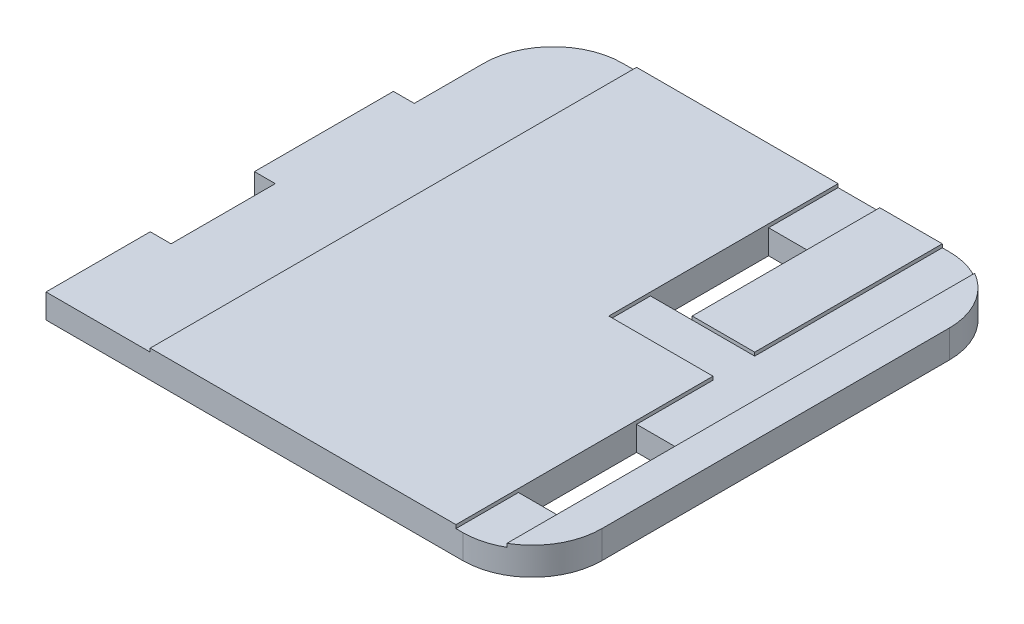
ISO-10303-21;
HEADER;
FILE_DESCRIPTION(('STEP AP214'),'2;1');
FILE_NAME('part.step','',(''),(''),'','','');
FILE_SCHEMA(('AUTOMOTIVE_DESIGN { 1 0 10303 214 1 1 1 1 }'));
ENDSEC;
DATA;
#1=APPLICATION_CONTEXT('core data for automotive mechanical design processes');
#2=APPLICATION_PROTOCOL_DEFINITION('international standard','automotive_design',2000,#1);
#3=PRODUCT_CONTEXT('',#1,'mechanical');
#4=PRODUCT('Part','Part','',(#3));
#5=PRODUCT_RELATED_PRODUCT_CATEGORY('part','',(#4));
#6=PRODUCT_DEFINITION_FORMATION('','',#4);
#7=PRODUCT_DEFINITION_CONTEXT('part definition',#1,'design');
#8=PRODUCT_DEFINITION('design','',#6,#7);
#9=PRODUCT_DEFINITION_SHAPE('','',#8);
#10=(LENGTH_UNIT() NAMED_UNIT(*) SI_UNIT(.MILLI.,.METRE.));
#11=(NAMED_UNIT(*) PLANE_ANGLE_UNIT() SI_UNIT($,.RADIAN.));
#12=(NAMED_UNIT(*) SI_UNIT($,.STERADIAN.) SOLID_ANGLE_UNIT());
#13=UNCERTAINTY_MEASURE_WITH_UNIT(LENGTH_MEASURE(1.E-05),#10,'distance_accuracy_value','');
#14=(GEOMETRIC_REPRESENTATION_CONTEXT(3) GLOBAL_UNCERTAINTY_ASSIGNED_CONTEXT((#13)) GLOBAL_UNIT_ASSIGNED_CONTEXT((#10,
#11,#12)) REPRESENTATION_CONTEXT('',''));
#15=CARTESIAN_POINT('',(0.,0.,0.));
#16=DIRECTION('',(0.,0.,1.));
#17=DIRECTION('',(1.,0.,0.));
#18=AXIS2_PLACEMENT_3D('',#15,#16,#17);
#19=CARTESIAN_POINT('',(0.,0.4,0.));
#20=DIRECTION('',(0.,1.,0.));
#21=DIRECTION('',(0.,0.,1.));
#22=AXIS2_PLACEMENT_3D('',#19,#20,#21);
#23=PLANE('',#22);
#24=DIRECTION('',(0.,0.,-1.));
#25=VECTOR('',#24,1.);
#26=CARTESIAN_POINT('',(1.5,0.4,0.));
#27=LINE('',#26,#25);
#28=CARTESIAN_POINT('',(1.5,0.4,0.));
#29=VERTEX_POINT('',#28);
#30=CARTESIAN_POINT('',(1.5,0.4,-7.));
#31=VERTEX_POINT('',#30);
#32=EDGE_CURVE('E317',#29,#31,#27,.T.);
#33=ORIENTED_EDGE('',*,*,#32,.F.);
#34=DIRECTION('',(1.,0.,0.));
#35=VECTOR('',#34,1.);
#36=CARTESIAN_POINT('',(0.,0.4,0.));
#37=LINE('',#36,#35);
#38=CARTESIAN_POINT('',(5.9,0.4,0.));
#39=VERTEX_POINT('',#38);
#40=EDGE_CURVE('E323',#29,#39,#37,.T.);
#41=ORIENTED_EDGE('',*,*,#40,.T.);
#42=DIRECTION('',(0.,0.,1.));
#43=VECTOR('',#42,1.);
#44=CARTESIAN_POINT('',(5.9,0.4,-0.9));
#45=LINE('',#44,#43);
#46=CARTESIAN_POINT('',(5.9,0.4,-3.7));
#47=VERTEX_POINT('',#46);
#48=EDGE_CURVE('E395',#47,#39,#45,.T.);
#49=ORIENTED_EDGE('',*,*,#48,.F.);
#50=DIRECTION('',(1.,0.,0.));
#51=VECTOR('',#50,1.);
#52=CARTESIAN_POINT('',(4.4,0.4,-3.7));
#53=LINE('',#52,#51);
#54=CARTESIAN_POINT('',(4.4,0.4,-3.7));
#55=VERTEX_POINT('',#54);
#56=EDGE_CURVE('E350',#55,#47,#53,.T.);
#57=ORIENTED_EDGE('',*,*,#56,.F.);
#58=DIRECTION('',(0.,0.,1.));
#59=VECTOR('',#58,1.);
#60=CARTESIAN_POINT('',(4.4,0.4,-6.));
#61=LINE('',#60,#59);
#62=CARTESIAN_POINT('',(4.4,0.4,-7.));
#63=VERTEX_POINT('',#62);
#64=EDGE_CURVE('E419',#63,#55,#61,.T.);
#65=ORIENTED_EDGE('',*,*,#64,.F.);
#66=DIRECTION('',(-1.,0.,0.));
#67=VECTOR('',#66,1.);
#68=CARTESIAN_POINT('',(7.,0.4,-7.));
#69=LINE('',#68,#67);
#70=EDGE_CURVE('E449',#63,#31,#69,.T.);
#71=ORIENTED_EDGE('',*,*,#70,.T.);
#72=EDGE_LOOP('',(#33,#41,#49,#57,#65,#71));
#73=FACE_BOUND('',#72,.T.);
#74=ADVANCED_FACE('F86',(#73),#23,.T.);
#75=CARTESIAN_POINT('',(5.9,0.4,-7.));
#76=VERTEX_POINT('',#75);
#77=CARTESIAN_POINT('',(5.,0.4,-7.));
#78=VERTEX_POINT('',#77);
#79=EDGE_CURVE('E452',#76,#78,#69,.T.);
#80=ORIENTED_EDGE('',*,*,#79,.T.);
#81=DIRECTION('',(0.,0.,-1.));
#82=VECTOR('',#81,1.);
#83=CARTESIAN_POINT('',(5.,0.4,-6.));
#84=LINE('',#83,#82);
#85=CARTESIAN_POINT('',(5.,0.4,-4.3));
#86=VERTEX_POINT('',#85);
#87=EDGE_CURVE('E421',#86,#78,#84,.T.);
#88=ORIENTED_EDGE('',*,*,#87,.F.);
#89=DIRECTION('',(1.,0.,0.));
#90=VECTOR('',#89,1.);
#91=CARTESIAN_POINT('',(4.4,0.4,-4.3));
#92=LINE('',#91,#90);
#93=CARTESIAN_POINT('',(5.9,0.4,-4.3));
#94=VERTEX_POINT('',#93);
#95=EDGE_CURVE('E367',#86,#94,#92,.T.);
#96=ORIENTED_EDGE('',*,*,#95,.T.);
#97=DIRECTION('',(0.,0.,-1.));
#98=VECTOR('',#97,1.);
#99=CARTESIAN_POINT('',(5.9,0.4,-4.3));
#100=LINE('',#99,#98);
#101=EDGE_CURVE('E370',#94,#76,#100,.T.);
#102=ORIENTED_EDGE('',*,*,#101,.T.);
#103=EDGE_LOOP('',(#80,#88,#96,#102));
#104=FACE_BOUND('',#103,.T.);
#105=ADVANCED_FACE('F569',(#104),#23,.T.);
#106=CARTESIAN_POINT('',(0.,0.4,-1.5));
#107=DIRECTION('',(1.,0.,0.));
#108=DIRECTION('',(0.,0.,-1.));
#109=AXIS2_PLACEMENT_3D('',#106,#107,#108);
#110=PLANE('',#109);
#111=DIRECTION('',(0.,0.,1.));
#112=VECTOR('',#111,1.);
#113=CARTESIAN_POINT('',(0.,0.35,0.));
#114=LINE('',#113,#112);
#115=CARTESIAN_POINT('',(0.,0.35,-1.5));
#116=VERTEX_POINT('',#115);
#117=CARTESIAN_POINT('',(0.,0.35,0.));
#118=VERTEX_POINT('',#117);
#119=EDGE_CURVE('E314',#116,#118,#114,.T.);
#120=ORIENTED_EDGE('',*,*,#119,.F.);
#121=DIRECTION('',(0.,-1.,0.));
#122=VECTOR('',#121,1.);
#123=CARTESIAN_POINT('',(0.,0.4,-1.5));
#124=LINE('',#123,#122);
#125=CARTESIAN_POINT('',(0.,0.,-1.5));
#126=VERTEX_POINT('',#125);
#127=EDGE_CURVE('E481',#116,#126,#124,.T.);
#128=ORIENTED_EDGE('',*,*,#127,.T.);
#129=DIRECTION('',(0.,0.,1.));
#130=VECTOR('',#129,1.);
#131=CARTESIAN_POINT('',(0.,0.,-1.5));
#132=LINE('',#131,#130);
#133=CARTESIAN_POINT('',(0.,0.,0.));
#134=VERTEX_POINT('',#133);
#135=EDGE_CURVE('E443',#126,#134,#132,.T.);
#136=ORIENTED_EDGE('',*,*,#135,.T.);
#137=DIRECTION('',(0.,-1.,0.));
#138=VECTOR('',#137,1.);
#139=CARTESIAN_POINT('',(0.,0.4,0.));
#140=LINE('',#139,#138);
#141=EDGE_CURVE('E493',#118,#134,#140,.T.);
#142=ORIENTED_EDGE('',*,*,#141,.F.);
#143=EDGE_LOOP('',(#120,#128,#136,#142));
#144=FACE_BOUND('',#143,.T.);
#145=ADVANCED_FACE('F581',(#144),#110,.F.);
#146=CARTESIAN_POINT('',(7.,0.4,-7.));
#147=DIRECTION('',(0.,0.,1.));
#148=DIRECTION('',(1.,0.,0.));
#149=AXIS2_PLACEMENT_3D('',#146,#147,#148);
#150=PLANE('',#149);
#151=DIRECTION('',(-1.,0.,0.));
#152=VECTOR('',#151,1.);
#153=CARTESIAN_POINT('',(0.,0.35,-7.));
#154=LINE('',#153,#152);
#155=CARTESIAN_POINT('',(1.5,0.35,-7.));
#156=VERTEX_POINT('',#155);
#157=CARTESIAN_POINT('',(1.3,0.35,-7.));
#158=VERTEX_POINT('',#157);
#159=EDGE_CURVE('E308',#156,#158,#154,.T.);
#160=ORIENTED_EDGE('',*,*,#159,.F.);
#161=DIRECTION('',(0.,1.,0.));
#162=VECTOR('',#161,1.);
#163=CARTESIAN_POINT('',(1.5,0.35,-7.));
#164=LINE('',#163,#162);
#165=EDGE_CURVE('E305',#156,#31,#164,.T.);
#166=ORIENTED_EDGE('',*,*,#165,.T.);
#167=ORIENTED_EDGE('',*,*,#70,.F.);
#168=DIRECTION('',(0.,1.,0.));
#169=VECTOR('',#168,1.);
#170=CARTESIAN_POINT('',(4.4,0.35,-7.));
#171=LINE('',#170,#169);
#172=CARTESIAN_POINT('',(4.4,0.35,-7.));
#173=VERTEX_POINT('',#172);
#174=EDGE_CURVE('E334',#173,#63,#171,.T.);
#175=ORIENTED_EDGE('',*,*,#174,.F.);
#176=DIRECTION('',(1.,0.,0.));
#177=VECTOR('',#176,1.);
#178=CARTESIAN_POINT('',(4.4,0.35,-7.));
#179=LINE('',#178,#177);
#180=CARTESIAN_POINT('',(5.,0.35,-7.));
#181=VERTEX_POINT('',#180);
#182=EDGE_CURVE('E343',#173,#181,#179,.T.);
#183=ORIENTED_EDGE('',*,*,#182,.T.);
#184=DIRECTION('',(0.,1.,0.));
#185=VECTOR('',#184,1.);
#186=CARTESIAN_POINT('',(5.,0.35,-7.));
#187=LINE('',#186,#185);
#188=EDGE_CURVE('E331',#181,#78,#187,.T.);
#189=ORIENTED_EDGE('',*,*,#188,.T.);
#190=ORIENTED_EDGE('',*,*,#79,.F.);
#191=DIRECTION('',(0.,1.,0.));
#192=VECTOR('',#191,1.);
#193=CARTESIAN_POINT('',(5.9,0.4,-7.));
#194=LINE('',#193,#192);
#195=CARTESIAN_POINT('',(5.9,0.35,-7.));
#196=VERTEX_POINT('',#195);
#197=EDGE_CURVE('E12',#196,#76,#194,.T.);
#198=ORIENTED_EDGE('',*,*,#197,.F.);
#199=DIRECTION('',(-1.,0.,0.));
#200=VECTOR('',#199,1.);
#201=CARTESIAN_POINT('',(7.,0.35,-7.));
#202=LINE('',#201,#200);
#203=CARTESIAN_POINT('',(6.,0.35,-7.));
#204=VERTEX_POINT('',#203);
#205=EDGE_CURVE('E325',#204,#196,#202,.T.);
#206=ORIENTED_EDGE('',*,*,#205,.F.);
#207=DIRECTION('',(0.,-1.,0.));
#208=VECTOR('',#207,1.);
#209=CARTESIAN_POINT('',(6.,0.4,-7.));
#210=LINE('',#209,#208);
#211=CARTESIAN_POINT('',(6.,0.,-7.));
#212=VERTEX_POINT('',#211);
#213=EDGE_CURVE('E517',#204,#212,#210,.T.);
#214=ORIENTED_EDGE('',*,*,#213,.T.);
#215=DIRECTION('',(-1.,0.,0.));
#216=VECTOR('',#215,1.);
#217=CARTESIAN_POINT('',(7.,0.,-7.));
#218=LINE('',#217,#216);
#219=CARTESIAN_POINT('',(1.3,0.,-7.));
#220=VERTEX_POINT('',#219);
#221=EDGE_CURVE('E461',#212,#220,#218,.T.);
#222=ORIENTED_EDGE('',*,*,#221,.T.);
#223=DIRECTION('',(0.,-1.,0.));
#224=VECTOR('',#223,1.);
#225=CARTESIAN_POINT('',(1.3,0.4,-7.));
#226=LINE('',#225,#224);
#227=EDGE_CURVE('E514',#220,#158,#226,.F.);
#228=ORIENTED_EDGE('',*,*,#227,.T.);
#229=EDGE_LOOP('',(#160,#166,#167,#175,#183,#189,#190,#198,#206,#214,#222,#228));
#230=FACE_BOUND('',#229,.T.);
#231=ADVANCED_FACE('F586',(#230),#150,.F.);
#232=CARTESIAN_POINT('',(0.299999999999999,0.4,-7.));
#233=DIRECTION('',(1.,0.,0.));
#234=DIRECTION('',(0.,0.,-1.));
#235=AXIS2_PLACEMENT_3D('',#232,#233,#234);
#236=PLANE('',#235);
#237=DIRECTION('',(0.,0.,1.));
#238=VECTOR('',#237,1.);
#239=CARTESIAN_POINT('',(0.3,0.35,0.));
#240=LINE('',#239,#238);
#241=CARTESIAN_POINT('',(0.299999999999999,0.35,-6.));
#242=VERTEX_POINT('',#241);
#243=CARTESIAN_POINT('',(0.299999999999999,0.35,-5.));
#244=VERTEX_POINT('',#243);
#245=EDGE_CURVE('E638',#242,#244,#240,.T.);
#246=ORIENTED_EDGE('',*,*,#245,.F.);
#247=DIRECTION('',(0.,-1.,0.));
#248=VECTOR('',#247,1.);
#249=CARTESIAN_POINT('',(0.299999999999999,0.4,-6.));
#250=LINE('',#249,#248);
#251=CARTESIAN_POINT('',(0.299999999999999,0.,-6.));
#252=VERTEX_POINT('',#251);
#253=EDGE_CURVE('E519',#242,#252,#250,.T.);
#254=ORIENTED_EDGE('',*,*,#253,.T.);
#255=DIRECTION('',(0.,0.,1.));
#256=VECTOR('',#255,1.);
#257=CARTESIAN_POINT('',(0.299999999999999,0.,-7.));
#258=LINE('',#257,#256);
#259=CARTESIAN_POINT('',(0.299999999999999,0.,-5.));
#260=VERTEX_POINT('',#259);
#261=EDGE_CURVE('E464',#252,#260,#258,.T.);
#262=ORIENTED_EDGE('',*,*,#261,.T.);
#263=DIRECTION('',(0.,-1.,0.));
#264=VECTOR('',#263,1.);
#265=CARTESIAN_POINT('',(0.299999999999999,0.4,-5.));
#266=LINE('',#265,#264);
#267=EDGE_CURVE('E491',#244,#260,#266,.T.);
#268=ORIENTED_EDGE('',*,*,#267,.F.);
#269=EDGE_LOOP('',(#246,#254,#262,#268));
#270=FACE_BOUND('',#269,.T.);
#271=ADVANCED_FACE('F680',(#270),#236,.F.);
#272=CARTESIAN_POINT('',(0.299999999999999,0.4,-5.));
#273=DIRECTION('',(0.,0.,1.));
#274=DIRECTION('',(1.,0.,0.));
#275=AXIS2_PLACEMENT_3D('',#272,#273,#274);
#276=PLANE('',#275);
#277=DIRECTION('',(-1.,0.,0.));
#278=VECTOR('',#277,1.);
#279=CARTESIAN_POINT('',(0.,0.35,-5.));
#280=LINE('',#279,#278);
#281=CARTESIAN_POINT('',(0.,0.35,-5.));
#282=VERTEX_POINT('',#281);
#283=EDGE_CURVE('E640',#244,#282,#280,.T.);
#284=ORIENTED_EDGE('',*,*,#283,.F.);
#285=ORIENTED_EDGE('',*,*,#267,.T.);
#286=DIRECTION('',(-1.,0.,0.));
#287=VECTOR('',#286,1.);
#288=CARTESIAN_POINT('',(0.299999999999999,0.,-5.));
#289=LINE('',#288,#287);
#290=CARTESIAN_POINT('',(0.,0.,-5.));
#291=VERTEX_POINT('',#290);
#292=EDGE_CURVE('E467',#260,#291,#289,.T.);
#293=ORIENTED_EDGE('',*,*,#292,.T.);
#294=DIRECTION('',(0.,-1.,0.));
#295=VECTOR('',#294,1.);
#296=CARTESIAN_POINT('',(0.,0.4,-5.));
#297=LINE('',#296,#295);
#298=EDGE_CURVE('E489',#282,#291,#297,.T.);
#299=ORIENTED_EDGE('',*,*,#298,.F.);
#300=EDGE_LOOP('',(#284,#285,#293,#299));
#301=FACE_BOUND('',#300,.T.);
#302=ADVANCED_FACE('F677',(#301),#276,.F.);
#303=CARTESIAN_POINT('',(0.,0.4,-5.));
#304=DIRECTION('',(1.,0.,0.));
#305=DIRECTION('',(0.,0.,-1.));
#306=AXIS2_PLACEMENT_3D('',#303,#304,#305);
#307=PLANE('',#306);
#308=DIRECTION('',(0.,0.,1.));
#309=VECTOR('',#308,1.);
#310=CARTESIAN_POINT('',(0.,0.35,0.));
#311=LINE('',#310,#309);
#312=CARTESIAN_POINT('',(0.,0.35,-3.));
#313=VERTEX_POINT('',#312);
#314=EDGE_CURVE('E645',#282,#313,#311,.T.);
#315=ORIENTED_EDGE('',*,*,#314,.F.);
#316=ORIENTED_EDGE('',*,*,#298,.T.);
#317=DIRECTION('',(0.,0.,1.));
#318=VECTOR('',#317,1.);
#319=CARTESIAN_POINT('',(0.,0.,-5.));
#320=LINE('',#319,#318);
#321=CARTESIAN_POINT('',(0.,0.,-3.));
#322=VERTEX_POINT('',#321);
#323=EDGE_CURVE('E470',#291,#322,#320,.T.);
#324=ORIENTED_EDGE('',*,*,#323,.T.);
#325=DIRECTION('',(0.,-1.,0.));
#326=VECTOR('',#325,1.);
#327=CARTESIAN_POINT('',(0.,0.4,-3.));
#328=LINE('',#327,#326);
#329=EDGE_CURVE('E487',#313,#322,#328,.T.);
#330=ORIENTED_EDGE('',*,*,#329,.F.);
#331=EDGE_LOOP('',(#315,#316,#324,#330));
#332=FACE_BOUND('',#331,.T.);
#333=ADVANCED_FACE('F672',(#332),#307,.F.);
#334=CARTESIAN_POINT('',(0.,0.4,-3.));
#335=DIRECTION('',(0.,0.,-1.));
#336=DIRECTION('',(-1.,0.,0.));
#337=AXIS2_PLACEMENT_3D('',#334,#335,#336);
#338=PLANE('',#337);
#339=DIRECTION('',(1.,0.,0.));
#340=VECTOR('',#339,1.);
#341=CARTESIAN_POINT('',(0.,0.35,-3.));
#342=LINE('',#341,#340);
#343=CARTESIAN_POINT('',(0.3,0.35,-3.));
#344=VERTEX_POINT('',#343);
#345=EDGE_CURVE('E647',#313,#344,#342,.T.);
#346=ORIENTED_EDGE('',*,*,#345,.F.);
#347=ORIENTED_EDGE('',*,*,#329,.T.);
#348=DIRECTION('',(1.,0.,0.));
#349=VECTOR('',#348,1.);
#350=CARTESIAN_POINT('',(0.,0.,-3.));
#351=LINE('',#350,#349);
#352=CARTESIAN_POINT('',(0.3,0.,-3.));
#353=VERTEX_POINT('',#352);
#354=EDGE_CURVE('E473',#322,#353,#351,.T.);
#355=ORIENTED_EDGE('',*,*,#354,.T.);
#356=DIRECTION('',(0.,-1.,0.));
#357=VECTOR('',#356,1.);
#358=CARTESIAN_POINT('',(0.3,0.4,-3.));
#359=LINE('',#358,#357);
#360=EDGE_CURVE('E485',#344,#353,#359,.T.);
#361=ORIENTED_EDGE('',*,*,#360,.F.);
#362=EDGE_LOOP('',(#346,#347,#355,#361));
#363=FACE_BOUND('',#362,.T.);
#364=ADVANCED_FACE('F668',(#363),#338,.F.);
#365=CARTESIAN_POINT('',(0.3,0.4,-3.));
#366=DIRECTION('',(1.,0.,0.));
#367=DIRECTION('',(0.,0.,-1.));
#368=AXIS2_PLACEMENT_3D('',#365,#366,#367);
#369=PLANE('',#368);
#370=DIRECTION('',(0.,0.,1.));
#371=VECTOR('',#370,1.);
#372=CARTESIAN_POINT('',(0.3,0.35,0.));
#373=LINE('',#372,#371);
#374=CARTESIAN_POINT('',(0.3,0.35,-1.5));
#375=VERTEX_POINT('',#374);
#376=EDGE_CURVE('E649',#344,#375,#373,.T.);
#377=ORIENTED_EDGE('',*,*,#376,.F.);
#378=ORIENTED_EDGE('',*,*,#360,.T.);
#379=DIRECTION('',(0.,0.,1.));
#380=VECTOR('',#379,1.);
#381=CARTESIAN_POINT('',(0.3,0.,-3.));
#382=LINE('',#381,#380);
#383=CARTESIAN_POINT('',(0.3,0.,-1.5));
#384=VERTEX_POINT('',#383);
#385=EDGE_CURVE('E476',#353,#384,#382,.T.);
#386=ORIENTED_EDGE('',*,*,#385,.T.);
#387=DIRECTION('',(0.,-1.,0.));
#388=VECTOR('',#387,1.);
#389=CARTESIAN_POINT('',(0.3,0.4,-1.5));
#390=LINE('',#389,#388);
#391=EDGE_CURVE('E483',#375,#384,#390,.T.);
#392=ORIENTED_EDGE('',*,*,#391,.F.);
#393=EDGE_LOOP('',(#377,#378,#386,#392));
#394=FACE_BOUND('',#393,.T.);
#395=ADVANCED_FACE('F664',(#394),#369,.F.);
#396=CARTESIAN_POINT('',(0.3,0.4,-1.5));
#397=DIRECTION('',(0.,0.,1.));
#398=DIRECTION('',(1.,0.,0.));
#399=AXIS2_PLACEMENT_3D('',#396,#397,#398);
#400=PLANE('',#399);
#401=DIRECTION('',(-1.,0.,0.));
#402=VECTOR('',#401,1.);
#403=CARTESIAN_POINT('',(0.,0.35,-1.5));
#404=LINE('',#403,#402);
#405=EDGE_CURVE('E327',#375,#116,#404,.T.);
#406=ORIENTED_EDGE('',*,*,#405,.F.);
#407=ORIENTED_EDGE('',*,*,#391,.T.);
#408=DIRECTION('',(-1.,0.,0.));
#409=VECTOR('',#408,1.);
#410=CARTESIAN_POINT('',(0.3,0.,-1.5));
#411=LINE('',#410,#409);
#412=EDGE_CURVE('E446',#384,#126,#411,.T.);
#413=ORIENTED_EDGE('',*,*,#412,.T.);
#414=ORIENTED_EDGE('',*,*,#127,.F.);
#415=EDGE_LOOP('',(#406,#407,#413,#414));
#416=FACE_BOUND('',#415,.T.);
#417=ADVANCED_FACE('F657',(#416),#400,.F.);
#418=CARTESIAN_POINT('',(4.4,0.4,-4.3));
#419=DIRECTION('',(0.,0.,-1.));
#420=DIRECTION('',(-1.,0.,0.));
#421=AXIS2_PLACEMENT_3D('',#418,#419,#420);
#422=PLANE('',#421);
#423=DIRECTION('',(0.,-1.,0.));
#424=VECTOR('',#423,1.);
#425=CARTESIAN_POINT('',(4.4,0.4,-4.3));
#426=LINE('',#425,#424);
#427=CARTESIAN_POINT('',(4.4,0.35,-4.3));
#428=VERTEX_POINT('',#427);
#429=CARTESIAN_POINT('',(4.4,0.,-4.3));
#430=VERTEX_POINT('',#429);
#431=EDGE_CURVE('E441',#428,#430,#426,.T.);
#432=ORIENTED_EDGE('',*,*,#431,.F.);
#433=DIRECTION('',(1.,0.,0.));
#434=VECTOR('',#433,1.);
#435=CARTESIAN_POINT('',(5.,0.35,-4.3));
#436=LINE('',#435,#434);
#437=CARTESIAN_POINT('',(5.,0.35,-4.3));
#438=VERTEX_POINT('',#437);
#439=EDGE_CURVE('E376',#428,#438,#436,.T.);
#440=ORIENTED_EDGE('',*,*,#439,.T.);
#441=DIRECTION('',(0.,-1.,0.));
#442=VECTOR('',#441,1.);
#443=CARTESIAN_POINT('',(5.,0.4,-4.3));
#444=LINE('',#443,#442);
#445=CARTESIAN_POINT('',(5.,0.,-4.3));
#446=VERTEX_POINT('',#445);
#447=EDGE_CURVE('E438',#438,#446,#444,.T.);
#448=ORIENTED_EDGE('',*,*,#447,.T.);
#449=DIRECTION('',(1.,0.,0.));
#450=VECTOR('',#449,1.);
#451=CARTESIAN_POINT('',(4.4,0.,-4.3));
#452=LINE('',#451,#450);
#453=EDGE_CURVE('E427',#430,#446,#452,.T.);
#454=ORIENTED_EDGE('',*,*,#453,.F.);
#455=EDGE_LOOP('',(#432,#440,#448,#454));
#456=FACE_BOUND('',#455,.T.);
#457=ADVANCED_FACE('F612',(#456),#422,.T.);
#458=CARTESIAN_POINT('',(4.4,0.4,-6.));
#459=DIRECTION('',(0.,0.,1.));
#460=DIRECTION('',(1.,0.,0.));
#461=AXIS2_PLACEMENT_3D('',#458,#459,#460);
#462=PLANE('',#461);
#463=DIRECTION('',(0.,-1.,0.));
#464=VECTOR('',#463,1.);
#465=CARTESIAN_POINT('',(5.,0.4,-6.));
#466=LINE('',#465,#464);
#467=CARTESIAN_POINT('',(5.,0.35,-6.));
#468=VERTEX_POINT('',#467);
#469=CARTESIAN_POINT('',(5.,0.,-6.));
#470=VERTEX_POINT('',#469);
#471=EDGE_CURVE('E436',#468,#470,#466,.T.);
#472=ORIENTED_EDGE('',*,*,#471,.F.);
#473=DIRECTION('',(1.,0.,0.));
#474=VECTOR('',#473,1.);
#475=CARTESIAN_POINT('',(4.4,0.35,-6.));
#476=LINE('',#475,#474);
#477=CARTESIAN_POINT('',(4.4,0.35,-6.));
#478=VERTEX_POINT('',#477);
#479=EDGE_CURVE('E338',#478,#468,#476,.T.);
#480=ORIENTED_EDGE('',*,*,#479,.F.);
#481=DIRECTION('',(0.,-1.,0.));
#482=VECTOR('',#481,1.);
#483=CARTESIAN_POINT('',(4.4,0.4,-6.));
#484=LINE('',#483,#482);
#485=CARTESIAN_POINT('',(4.4,0.,-6.));
#486=VERTEX_POINT('',#485);
#487=EDGE_CURVE('E424',#478,#486,#484,.T.);
#488=ORIENTED_EDGE('',*,*,#487,.T.);
#489=DIRECTION('',(-1.,0.,0.));
#490=VECTOR('',#489,1.);
#491=CARTESIAN_POINT('',(4.4,0.,-6.));
#492=LINE('',#491,#490);
#493=EDGE_CURVE('E422',#470,#486,#492,.T.);
#494=ORIENTED_EDGE('',*,*,#493,.F.);
#495=EDGE_LOOP('',(#472,#480,#488,#494));
#496=FACE_BOUND('',#495,.T.);
#497=ADVANCED_FACE('F606',(#496),#462,.T.);
#498=CARTESIAN_POINT('',(5.9,0.4,-2.6));
#499=DIRECTION('',(0.,0.,1.));
#500=DIRECTION('',(1.,0.,0.));
#501=AXIS2_PLACEMENT_3D('',#498,#499,#500);
#502=PLANE('',#501);
#503=DIRECTION('',(0.,-1.,0.));
#504=VECTOR('',#503,1.);
#505=CARTESIAN_POINT('',(6.5,0.4,-2.6));
#506=LINE('',#505,#504);
#507=CARTESIAN_POINT('',(6.5,0.35,-2.6));
#508=VERTEX_POINT('',#507);
#509=CARTESIAN_POINT('',(6.5,0.,-2.6));
#510=VERTEX_POINT('',#509);
#511=EDGE_CURVE('E412',#508,#510,#506,.T.);
#512=ORIENTED_EDGE('',*,*,#511,.F.);
#513=DIRECTION('',(-1.,0.,0.));
#514=VECTOR('',#513,1.);
#515=CARTESIAN_POINT('',(6.5,0.35,-2.6));
#516=LINE('',#515,#514);
#517=CARTESIAN_POINT('',(5.9,0.35,-2.6));
#518=VERTEX_POINT('',#517);
#519=EDGE_CURVE('E383',#508,#518,#516,.T.);
#520=ORIENTED_EDGE('',*,*,#519,.T.);
#521=DIRECTION('',(0.,-1.,0.));
#522=VECTOR('',#521,1.);
#523=CARTESIAN_POINT('',(5.9,0.4,-2.6));
#524=LINE('',#523,#522);
#525=CARTESIAN_POINT('',(5.9,0.,-2.6));
#526=VERTEX_POINT('',#525);
#527=EDGE_CURVE('E400',#518,#526,#524,.T.);
#528=ORIENTED_EDGE('',*,*,#527,.T.);
#529=DIRECTION('',(-1.,0.,0.));
#530=VECTOR('',#529,1.);
#531=CARTESIAN_POINT('',(5.9,0.,-2.6));
#532=LINE('',#531,#530);
#533=EDGE_CURVE('E398',#510,#526,#532,.T.);
#534=ORIENTED_EDGE('',*,*,#533,.F.);
#535=EDGE_LOOP('',(#512,#520,#528,#534));
#536=FACE_BOUND('',#535,.T.);
#537=ADVANCED_FACE('F628',(#536),#502,.T.);
#538=CARTESIAN_POINT('',(6.,0.4,-1.));
#539=DIRECTION('',(0.,-1.,0.));
#540=DIRECTION('',(0.,0.,-1.));
#541=AXIS2_PLACEMENT_3D('',#538,#539,#540);
#542=CYLINDRICAL_SURFACE('',#541,1.);
#543=CARTESIAN_POINT('',(6.,0.4,-1.));
#544=DIRECTION('',(0.,1.,0.));
#545=DIRECTION('',(0.,0.,1.));
#546=AXIS2_PLACEMENT_3D('',#543,#544,#545);
#547=CIRCLE('',#546,1.);
#548=CARTESIAN_POINT('',(6.5,0.4,-0.133974596215561));
#549=VERTEX_POINT('',#548);
#550=CARTESIAN_POINT('',(7.,0.4,-1.));
#551=VERTEX_POINT('',#550);
#552=EDGE_CURVE('E512',#549,#551,#547,.T.);
#553=ORIENTED_EDGE('',*,*,#552,.F.);
#554=DIRECTION('',(0.,-1.,0.));
#555=VECTOR('',#554,1.);
#556=CARTESIAN_POINT('',(6.5,0.4,-0.133974596215561));
#557=LINE('',#556,#555);
#558=CARTESIAN_POINT('',(6.5,0.35,-0.133974596215561));
#559=VERTEX_POINT('',#558);
#560=EDGE_CURVE('E94',#549,#559,#557,.T.);
#561=ORIENTED_EDGE('',*,*,#560,.T.);
#562=CARTESIAN_POINT('',(6.,0.35,-1.));
#563=DIRECTION('',(0.,-1.,0.));
#564=DIRECTION('',(0.,0.,-1.));
#565=AXIS2_PLACEMENT_3D('',#562,#563,#564);
#566=CIRCLE('',#565,1.);
#567=CARTESIAN_POINT('',(6.,0.35,0.));
#568=VERTEX_POINT('',#567);
#569=EDGE_CURVE('E527',#568,#559,#566,.F.);
#570=ORIENTED_EDGE('',*,*,#569,.F.);
#571=DIRECTION('',(0.,-1.,0.));
#572=VECTOR('',#571,1.);
#573=CARTESIAN_POINT('',(6.,0.4,0.));
#574=LINE('',#573,#572);
#575=CARTESIAN_POINT('',(6.,0.,0.));
#576=VERTEX_POINT('',#575);
#577=EDGE_CURVE('E506',#576,#568,#574,.F.);
#578=ORIENTED_EDGE('',*,*,#577,.F.);
#579=CARTESIAN_POINT('',(6.,0.,-1.));
#580=DIRECTION('',(0.,1.,0.));
#581=DIRECTION('',(0.,0.,1.));
#582=AXIS2_PLACEMENT_3D('',#579,#580,#581);
#583=CIRCLE('',#582,1.);
#584=CARTESIAN_POINT('',(7.,0.,-1.));
#585=VERTEX_POINT('',#584);
#586=EDGE_CURVE('E504',#585,#576,#583,.F.);
#587=ORIENTED_EDGE('',*,*,#586,.F.);
#588=DIRECTION('',(0.,-1.,0.));
#589=VECTOR('',#588,1.);
#590=CARTESIAN_POINT('',(7.,0.4,-1.));
#591=LINE('',#590,#589);
#592=EDGE_CURVE('E497',#551,#585,#591,.T.);
#593=ORIENTED_EDGE('',*,*,#592,.F.);
#594=EDGE_LOOP('',(#553,#561,#570,#578,#587,#593));
#595=FACE_BOUND('',#594,.T.);
#596=ADVANCED_FACE('F532',(#595),#542,.T.);
#597=CARTESIAN_POINT('',(1.3,0.4,-6.));
#598=DIRECTION('',(0.,-1.,0.));
#599=DIRECTION('',(0.,0.,-1.));
#600=AXIS2_PLACEMENT_3D('',#597,#598,#599);
#601=CYLINDRICAL_SURFACE('',#600,1.);
#602=ORIENTED_EDGE('',*,*,#253,.F.);
#603=CARTESIAN_POINT('',(1.3,0.35,-6.));
#604=DIRECTION('',(0.,1.,0.));
#605=DIRECTION('',(0.,0.,1.));
#606=AXIS2_PLACEMENT_3D('',#603,#604,#605);
#607=CIRCLE('',#606,1.);
#608=EDGE_CURVE('E636',#158,#242,#607,.T.);
#609=ORIENTED_EDGE('',*,*,#608,.F.);
#610=ORIENTED_EDGE('',*,*,#227,.F.);
#611=CARTESIAN_POINT('',(1.3,0.,-6.));
#612=DIRECTION('',(0.,1.,0.));
#613=DIRECTION('',(0.,0.,1.));
#614=AXIS2_PLACEMENT_3D('',#611,#612,#613);
#615=CIRCLE('',#614,1.);
#616=EDGE_CURVE('E500',#252,#220,#615,.F.);
#617=ORIENTED_EDGE('',*,*,#616,.F.);
#618=EDGE_LOOP('',(#602,#609,#610,#617));
#619=FACE_BOUND('',#618,.T.);
#620=ADVANCED_FACE('F88',(#619),#601,.T.);
#621=CARTESIAN_POINT('',(6.,0.4,-6.));
#622=DIRECTION('',(0.,1.,0.));
#623=DIRECTION('',(0.,0.,1.));
#624=AXIS2_PLACEMENT_3D('',#621,#622,#623);
#625=CIRCLE('',#624,1.);
#626=CARTESIAN_POINT('',(7.,0.4,-6.));
#627=VERTEX_POINT('',#626);
#628=CARTESIAN_POINT('',(6.5,0.4,-6.86602540378444));
#629=VERTEX_POINT('',#628);
#630=EDGE_CURVE('E509',#627,#629,#625,.T.);
#631=ORIENTED_EDGE('',*,*,#630,.T.);
#632=DIRECTION('',(0.,0.,-1.));
#633=VECTOR('',#632,1.);
#634=CARTESIAN_POINT('',(6.5,0.4,-0.9));
#635=LINE('',#634,#633);
#636=EDGE_CURVE('E397',#549,#629,#635,.T.);
#637=ORIENTED_EDGE('',*,*,#636,.F.);
#638=ORIENTED_EDGE('',*,*,#552,.T.);
#639=DIRECTION('',(0.,0.,-1.));
#640=VECTOR('',#639,1.);
#641=CARTESIAN_POINT('',(7.,0.4,0.));
#642=LINE('',#641,#640);
#643=EDGE_CURVE('E445',#551,#627,#642,.T.);
#644=ORIENTED_EDGE('',*,*,#643,.T.);
#645=EDGE_LOOP('',(#631,#637,#638,#644));
#646=FACE_BOUND('',#645,.T.);
#647=ADVANCED_FACE('F566',(#646),#23,.T.);
#648=CARTESIAN_POINT('',(0.,0.,0.));
#649=DIRECTION('',(0.,1.,0.));
#650=DIRECTION('',(0.,0.,1.));
#651=AXIS2_PLACEMENT_3D('',#648,#649,#650);
#652=PLANE('',#651);
#653=DIRECTION('',(0.,0.,1.));
#654=VECTOR('',#653,1.);
#655=CARTESIAN_POINT('',(4.4,0.,-6.));
#656=LINE('',#655,#654);
#657=EDGE_CURVE('E418',#486,#430,#656,.T.);
#658=ORIENTED_EDGE('',*,*,#657,.T.);
#659=ORIENTED_EDGE('',*,*,#453,.T.);
#660=DIRECTION('',(0.,0.,-1.));
#661=VECTOR('',#660,1.);
#662=CARTESIAN_POINT('',(5.,0.,-6.));
#663=LINE('',#662,#661);
#664=EDGE_CURVE('E430',#446,#470,#663,.T.);
#665=ORIENTED_EDGE('',*,*,#664,.T.);
#666=ORIENTED_EDGE('',*,*,#493,.T.);
#667=EDGE_LOOP('',(#658,#659,#665,#666));
#668=FACE_BOUND('',#667,.T.);
#669=DIRECTION('',(0.,0.,-1.));
#670=VECTOR('',#669,1.);
#671=CARTESIAN_POINT('',(7.,0.,0.));
#672=LINE('',#671,#670);
#673=CARTESIAN_POINT('',(7.,0.,-6.));
#674=VERTEX_POINT('',#673);
#675=EDGE_CURVE('E458',#585,#674,#672,.T.);
#676=ORIENTED_EDGE('',*,*,#675,.F.);
#677=ORIENTED_EDGE('',*,*,#586,.T.);
#678=DIRECTION('',(1.,0.,0.));
#679=VECTOR('',#678,1.);
#680=CARTESIAN_POINT('',(0.,0.,0.));
#681=LINE('',#680,#679);
#682=EDGE_CURVE('E455',#134,#576,#681,.T.);
#683=ORIENTED_EDGE('',*,*,#682,.F.);
#684=ORIENTED_EDGE('',*,*,#135,.F.);
#685=ORIENTED_EDGE('',*,*,#412,.F.);
#686=ORIENTED_EDGE('',*,*,#385,.F.);
#687=ORIENTED_EDGE('',*,*,#354,.F.);
#688=ORIENTED_EDGE('',*,*,#323,.F.);
#689=ORIENTED_EDGE('',*,*,#292,.F.);
#690=ORIENTED_EDGE('',*,*,#261,.F.);
#691=ORIENTED_EDGE('',*,*,#616,.T.);
#692=ORIENTED_EDGE('',*,*,#221,.F.);
#693=CARTESIAN_POINT('',(6.,0.,-6.));
#694=DIRECTION('',(0.,1.,0.));
#695=DIRECTION('',(0.,0.,1.));
#696=AXIS2_PLACEMENT_3D('',#693,#694,#695);
#697=CIRCLE('',#696,1.);
#698=EDGE_CURVE('E502',#212,#674,#697,.F.);
#699=ORIENTED_EDGE('',*,*,#698,.T.);
#700=EDGE_LOOP('',(#676,#677,#683,#684,#685,#686,#687,#688,#689,#690,#691,#692,#699));
#701=FACE_BOUND('',#700,.T.);
#702=DIRECTION('',(0.,0.,1.));
#703=VECTOR('',#702,1.);
#704=CARTESIAN_POINT('',(5.9,0.,-0.9));
#705=LINE('',#704,#703);
#706=CARTESIAN_POINT('',(5.9,0.,-0.9));
#707=VERTEX_POINT('',#706);
#708=EDGE_CURVE('E394',#526,#707,#705,.T.);
#709=ORIENTED_EDGE('',*,*,#708,.T.);
#710=DIRECTION('',(1.,0.,0.));
#711=VECTOR('',#710,1.);
#712=CARTESIAN_POINT('',(5.9,0.,-0.9));
#713=LINE('',#712,#711);
#714=CARTESIAN_POINT('',(6.5,0.,-0.9));
#715=VERTEX_POINT('',#714);
#716=EDGE_CURVE('E403',#707,#715,#713,.T.);
#717=ORIENTED_EDGE('',*,*,#716,.T.);
#718=DIRECTION('',(0.,0.,-1.));
#719=VECTOR('',#718,1.);
#720=CARTESIAN_POINT('',(6.5,0.,-0.9));
#721=LINE('',#720,#719);
#722=EDGE_CURVE('E406',#715,#510,#721,.T.);
#723=ORIENTED_EDGE('',*,*,#722,.T.);
#724=ORIENTED_EDGE('',*,*,#533,.T.);
#725=EDGE_LOOP('',(#709,#717,#723,#724));
#726=FACE_BOUND('',#725,.T.);
#727=ADVANCED_FACE('F557',(#668,#701,#726),#652,.F.);
#728=CARTESIAN_POINT('',(0.,0.4,0.));
#729=DIRECTION('',(0.,0.,-1.));
#730=DIRECTION('',(-1.,0.,0.));
#731=AXIS2_PLACEMENT_3D('',#728,#729,#730);
#732=PLANE('',#731);
#733=ORIENTED_EDGE('',*,*,#40,.F.);
#734=DIRECTION('',(0.,1.,0.));
#735=VECTOR('',#734,1.);
#736=CARTESIAN_POINT('',(1.5,0.35,0.));
#737=LINE('',#736,#735);
#738=CARTESIAN_POINT('',(1.5,0.35,0.));
#739=VERTEX_POINT('',#738);
#740=EDGE_CURVE('E302',#739,#29,#737,.T.);
#741=ORIENTED_EDGE('',*,*,#740,.F.);
#742=DIRECTION('',(1.,0.,0.));
#743=VECTOR('',#742,1.);
#744=CARTESIAN_POINT('',(0.,0.35,0.));
#745=LINE('',#744,#743);
#746=EDGE_CURVE('E309',#118,#739,#745,.T.);
#747=ORIENTED_EDGE('',*,*,#746,.F.);
#748=ORIENTED_EDGE('',*,*,#141,.T.);
#749=ORIENTED_EDGE('',*,*,#682,.T.);
#750=ORIENTED_EDGE('',*,*,#577,.T.);
#751=DIRECTION('',(1.,0.,0.));
#752=VECTOR('',#751,1.);
#753=CARTESIAN_POINT('',(5.9,0.35,0.));
#754=LINE('',#753,#752);
#755=CARTESIAN_POINT('',(5.9,0.35,0.));
#756=VERTEX_POINT('',#755);
#757=EDGE_CURVE('E109',#756,#568,#754,.T.);
#758=ORIENTED_EDGE('',*,*,#757,.F.);
#759=DIRECTION('',(0.,1.,0.));
#760=VECTOR('',#759,1.);
#761=CARTESIAN_POINT('',(5.9,0.35,0.));
#762=LINE('',#761,#760);
#763=EDGE_CURVE('E347',#756,#39,#762,.T.);
#764=ORIENTED_EDGE('',*,*,#763,.T.);
#765=EDGE_LOOP('',(#733,#741,#747,#748,#749,#750,#758,#764));
#766=FACE_BOUND('',#765,.T.);
#767=ADVANCED_FACE('F320',(#766),#732,.F.);
#768=CARTESIAN_POINT('',(7.,0.4,0.));
#769=DIRECTION('',(-1.,0.,0.));
#770=DIRECTION('',(0.,0.,1.));
#771=AXIS2_PLACEMENT_3D('',#768,#769,#770);
#772=PLANE('',#771);
#773=ORIENTED_EDGE('',*,*,#643,.F.);
#774=ORIENTED_EDGE('',*,*,#592,.T.);
#775=ORIENTED_EDGE('',*,*,#675,.T.);
#776=DIRECTION('',(0.,-1.,0.));
#777=VECTOR('',#776,1.);
#778=CARTESIAN_POINT('',(7.,0.4,-6.));
#779=LINE('',#778,#777);
#780=EDGE_CURVE('E495',#674,#627,#779,.F.);
#781=ORIENTED_EDGE('',*,*,#780,.T.);
#782=EDGE_LOOP('',(#773,#774,#775,#781));
#783=FACE_BOUND('',#782,.T.);
#784=ADVANCED_FACE('F555',(#783),#772,.F.);
#785=CARTESIAN_POINT('',(4.4,0.4,-6.));
#786=DIRECTION('',(1.,0.,0.));
#787=DIRECTION('',(0.,0.,-1.));
#788=AXIS2_PLACEMENT_3D('',#785,#786,#787);
#789=PLANE('',#788);
#790=ORIENTED_EDGE('',*,*,#657,.F.);
#791=ORIENTED_EDGE('',*,*,#487,.F.);
#792=DIRECTION('',(0.,0.,-1.));
#793=VECTOR('',#792,1.);
#794=CARTESIAN_POINT('',(4.4,0.35,-6.));
#795=LINE('',#794,#793);
#796=EDGE_CURVE('E101',#478,#173,#795,.T.);
#797=ORIENTED_EDGE('',*,*,#796,.T.);
#798=ORIENTED_EDGE('',*,*,#174,.T.);
#799=ORIENTED_EDGE('',*,*,#64,.T.);
#800=DIRECTION('',(0.,1.,0.));
#801=VECTOR('',#800,1.);
#802=CARTESIAN_POINT('',(4.4,0.35,-3.7));
#803=LINE('',#802,#801);
#804=CARTESIAN_POINT('',(4.4,0.35,-3.7));
#805=VERTEX_POINT('',#804);
#806=EDGE_CURVE('E359',#805,#55,#803,.T.);
#807=ORIENTED_EDGE('',*,*,#806,.F.);
#808=DIRECTION('',(0.,0.,1.));
#809=VECTOR('',#808,1.);
#810=CARTESIAN_POINT('',(4.4,0.35,-4.3));
#811=LINE('',#810,#809);
#812=EDGE_CURVE('E371',#428,#805,#811,.T.);
#813=ORIENTED_EDGE('',*,*,#812,.F.);
#814=ORIENTED_EDGE('',*,*,#431,.T.);
#815=EDGE_LOOP('',(#790,#791,#797,#798,#799,#807,#813,#814));
#816=FACE_BOUND('',#815,.T.);
#817=ADVANCED_FACE('F619',(#816),#789,.T.);
#818=CARTESIAN_POINT('',(5.,0.4,-6.));
#819=DIRECTION('',(-1.,0.,0.));
#820=DIRECTION('',(0.,0.,1.));
#821=AXIS2_PLACEMENT_3D('',#818,#819,#820);
#822=PLANE('',#821);
#823=ORIENTED_EDGE('',*,*,#664,.F.);
#824=ORIENTED_EDGE('',*,*,#447,.F.);
#825=EDGE_CURVE('E439',#86,#438,#444,.T.);
#826=ORIENTED_EDGE('',*,*,#825,.F.);
#827=ORIENTED_EDGE('',*,*,#87,.T.);
#828=ORIENTED_EDGE('',*,*,#188,.F.);
#829=DIRECTION('',(0.,0.,-1.));
#830=VECTOR('',#829,1.);
#831=CARTESIAN_POINT('',(5.,0.35,-6.));
#832=LINE('',#831,#830);
#833=EDGE_CURVE('E340',#468,#181,#832,.T.);
#834=ORIENTED_EDGE('',*,*,#833,.F.);
#835=ORIENTED_EDGE('',*,*,#471,.T.);
#836=EDGE_LOOP('',(#823,#824,#826,#827,#828,#834,#835));
#837=FACE_BOUND('',#836,.T.);
#838=ADVANCED_FACE('F599',(#837),#822,.T.);
#839=CARTESIAN_POINT('',(5.9,0.4,-0.9));
#840=DIRECTION('',(1.,0.,0.));
#841=DIRECTION('',(0.,0.,-1.));
#842=AXIS2_PLACEMENT_3D('',#839,#840,#841);
#843=PLANE('',#842);
#844=ORIENTED_EDGE('',*,*,#708,.F.);
#845=ORIENTED_EDGE('',*,*,#527,.F.);
#846=DIRECTION('',(0.,0.,1.));
#847=VECTOR('',#846,1.);
#848=CARTESIAN_POINT('',(5.9,0.35,-3.7));
#849=LINE('',#848,#847);
#850=CARTESIAN_POINT('',(5.9,0.35,-3.7));
#851=VERTEX_POINT('',#850);
#852=EDGE_CURVE('E386',#851,#518,#849,.T.);
#853=ORIENTED_EDGE('',*,*,#852,.F.);
#854=DIRECTION('',(0.,1.,0.));
#855=VECTOR('',#854,1.);
#856=CARTESIAN_POINT('',(5.9,0.35,-3.7));
#857=LINE('',#856,#855);
#858=EDGE_CURVE('E363',#851,#47,#857,.T.);
#859=ORIENTED_EDGE('',*,*,#858,.T.);
#860=ORIENTED_EDGE('',*,*,#48,.T.);
#861=ORIENTED_EDGE('',*,*,#763,.F.);
#862=DIRECTION('',(0.,0.,1.));
#863=VECTOR('',#862,1.);
#864=CARTESIAN_POINT('',(5.9,0.35,-0.9));
#865=LINE('',#864,#863);
#866=CARTESIAN_POINT('',(5.9,0.35,-0.9));
#867=VERTEX_POINT('',#866);
#868=EDGE_CURVE('E349',#867,#756,#865,.T.);
#869=ORIENTED_EDGE('',*,*,#868,.F.);
#870=DIRECTION('',(0.,-1.,0.));
#871=VECTOR('',#870,1.);
#872=CARTESIAN_POINT('',(5.9,0.4,-0.9));
#873=LINE('',#872,#871);
#874=EDGE_CURVE('E416',#867,#707,#873,.T.);
#875=ORIENTED_EDGE('',*,*,#874,.T.);
#876=EDGE_LOOP('',(#844,#845,#853,#859,#860,#861,#869,#875));
#877=FACE_BOUND('',#876,.T.);
#878=ADVANCED_FACE('F548',(#877),#843,.T.);
#879=CARTESIAN_POINT('',(5.9,0.4,-0.9));
#880=DIRECTION('',(0.,0.,-1.));
#881=DIRECTION('',(-1.,0.,0.));
#882=AXIS2_PLACEMENT_3D('',#879,#880,#881);
#883=PLANE('',#882);
#884=DIRECTION('',(1.,0.,0.));
#885=VECTOR('',#884,1.);
#886=CARTESIAN_POINT('',(5.9,0.35,-0.9));
#887=LINE('',#886,#885);
#888=CARTESIAN_POINT('',(6.5,0.35,-0.9));
#889=VERTEX_POINT('',#888);
#890=EDGE_CURVE('E352',#867,#889,#887,.T.);
#891=ORIENTED_EDGE('',*,*,#890,.T.);
#892=DIRECTION('',(0.,-1.,0.));
#893=VECTOR('',#892,1.);
#894=CARTESIAN_POINT('',(6.5,0.4,-0.9));
#895=LINE('',#894,#893);
#896=EDGE_CURVE('E414',#889,#715,#895,.T.);
#897=ORIENTED_EDGE('',*,*,#896,.T.);
#898=ORIENTED_EDGE('',*,*,#716,.F.);
#899=ORIENTED_EDGE('',*,*,#874,.F.);
#900=EDGE_LOOP('',(#891,#897,#898,#899));
#901=FACE_BOUND('',#900,.T.);
#902=ADVANCED_FACE('F544',(#901),#883,.T.);
#903=CARTESIAN_POINT('',(6.5,0.4,-0.9));
#904=DIRECTION('',(-1.,0.,0.));
#905=DIRECTION('',(0.,0.,1.));
#906=AXIS2_PLACEMENT_3D('',#903,#904,#905);
#907=PLANE('',#906);
#908=ORIENTED_EDGE('',*,*,#722,.F.);
#909=ORIENTED_EDGE('',*,*,#896,.F.);
#910=DIRECTION('',(0.,0.,1.));
#911=VECTOR('',#910,1.);
#912=CARTESIAN_POINT('',(6.5,0.35,-0.9));
#913=LINE('',#912,#911);
#914=EDGE_CURVE('E355',#889,#559,#913,.T.);
#915=ORIENTED_EDGE('',*,*,#914,.T.);
#916=ORIENTED_EDGE('',*,*,#560,.F.);
#917=ORIENTED_EDGE('',*,*,#636,.T.);
#918=DIRECTION('',(0.,-1.,0.));
#919=VECTOR('',#918,1.);
#920=CARTESIAN_POINT('',(6.5,0.4,-6.86602540378444));
#921=LINE('',#920,#919);
#922=CARTESIAN_POINT('',(6.5,0.35,-6.86602540378444));
#923=VERTEX_POINT('',#922);
#924=EDGE_CURVE('E524',#629,#923,#921,.T.);
#925=ORIENTED_EDGE('',*,*,#924,.T.);
#926=DIRECTION('',(0.,0.,-1.));
#927=VECTOR('',#926,1.);
#928=CARTESIAN_POINT('',(6.5,0.35,-2.6));
#929=LINE('',#928,#927);
#930=EDGE_CURVE('E381',#508,#923,#929,.T.);
#931=ORIENTED_EDGE('',*,*,#930,.F.);
#932=ORIENTED_EDGE('',*,*,#511,.T.);
#933=EDGE_LOOP('',(#908,#909,#915,#916,#917,#925,#931,#932));
#934=FACE_BOUND('',#933,.T.);
#935=ADVANCED_FACE('F537',(#934),#907,.T.);
#936=CARTESIAN_POINT('',(6.,0.4,-6.));
#937=DIRECTION('',(0.,-1.,0.));
#938=DIRECTION('',(0.,0.,-1.));
#939=AXIS2_PLACEMENT_3D('',#936,#937,#938);
#940=CYLINDRICAL_SURFACE('',#939,1.);
#941=ORIENTED_EDGE('',*,*,#924,.F.);
#942=ORIENTED_EDGE('',*,*,#630,.F.);
#943=ORIENTED_EDGE('',*,*,#780,.F.);
#944=ORIENTED_EDGE('',*,*,#698,.F.);
#945=ORIENTED_EDGE('',*,*,#213,.F.);
#946=CARTESIAN_POINT('',(6.,0.35,-6.));
#947=DIRECTION('',(0.,1.,0.));
#948=DIRECTION('',(0.,0.,1.));
#949=AXIS2_PLACEMENT_3D('',#946,#947,#948);
#950=CIRCLE('',#949,1.);
#951=EDGE_CURVE('E521',#204,#923,#950,.F.);
#952=ORIENTED_EDGE('',*,*,#951,.T.);
#953=EDGE_LOOP('',(#941,#942,#943,#944,#945,#952));
#954=FACE_BOUND('',#953,.T.);
#955=ADVANCED_FACE('F563',(#954),#940,.T.);
#956=CARTESIAN_POINT('',(1.5,0.35,0.));
#957=DIRECTION('',(1.,0.,0.));
#958=DIRECTION('',(0.,0.,-1.));
#959=AXIS2_PLACEMENT_3D('',#956,#957,#958);
#960=PLANE('',#959);
#961=ORIENTED_EDGE('',*,*,#32,.T.);
#962=ORIENTED_EDGE('',*,*,#165,.F.);
#963=DIRECTION('',(0.,0.,-1.));
#964=VECTOR('',#963,1.);
#965=CARTESIAN_POINT('',(1.5,0.35,0.));
#966=LINE('',#965,#964);
#967=EDGE_CURVE('E298',#739,#156,#966,.T.);
#968=ORIENTED_EDGE('',*,*,#967,.F.);
#969=ORIENTED_EDGE('',*,*,#740,.T.);
#970=EDGE_LOOP('',(#961,#962,#968,#969));
#971=FACE_BOUND('',#970,.T.);
#972=ADVANCED_FACE('F300',(#971),#960,.F.);
#973=CARTESIAN_POINT('',(0.,0.35,0.));
#974=DIRECTION('',(0.,1.,0.));
#975=DIRECTION('',(0.,0.,1.));
#976=AXIS2_PLACEMENT_3D('',#973,#974,#975);
#977=PLANE('',#976);
#978=ORIENTED_EDGE('',*,*,#746,.T.);
#979=ORIENTED_EDGE('',*,*,#967,.T.);
#980=ORIENTED_EDGE('',*,*,#159,.T.);
#981=ORIENTED_EDGE('',*,*,#608,.T.);
#982=ORIENTED_EDGE('',*,*,#245,.T.);
#983=ORIENTED_EDGE('',*,*,#283,.T.);
#984=ORIENTED_EDGE('',*,*,#314,.T.);
#985=ORIENTED_EDGE('',*,*,#345,.T.);
#986=ORIENTED_EDGE('',*,*,#376,.T.);
#987=ORIENTED_EDGE('',*,*,#405,.T.);
#988=ORIENTED_EDGE('',*,*,#119,.T.);
#989=EDGE_LOOP('',(#978,#979,#980,#981,#982,#983,#984,#985,#986,#987,#988));
#990=FACE_BOUND('',#989,.T.);
#991=ADVANCED_FACE('F312',(#990),#977,.T.);
#992=CARTESIAN_POINT('',(5.9,0.35,-4.3));
#993=DIRECTION('',(1.,0.,0.));
#994=DIRECTION('',(0.,0.,-1.));
#995=AXIS2_PLACEMENT_3D('',#992,#993,#994);
#996=PLANE('',#995);
#997=ORIENTED_EDGE('',*,*,#197,.T.);
#998=ORIENTED_EDGE('',*,*,#101,.F.);
#999=DIRECTION('',(0.,1.,0.));
#1000=VECTOR('',#999,1.);
#1001=CARTESIAN_POINT('',(5.9,0.35,-4.3));
#1002=LINE('',#1001,#1000);
#1003=CARTESIAN_POINT('',(5.9,0.35,-4.3));
#1004=VERTEX_POINT('',#1003);
#1005=EDGE_CURVE('E346',#1004,#94,#1002,.T.);
#1006=ORIENTED_EDGE('',*,*,#1005,.F.);
#1007=DIRECTION('',(0.,0.,1.));
#1008=VECTOR('',#1007,1.);
#1009=CARTESIAN_POINT('',(5.9,0.35,-7.26887688161071));
#1010=LINE('',#1009,#1008);
#1011=EDGE_CURVE('E379',#196,#1004,#1010,.T.);
#1012=ORIENTED_EDGE('',*,*,#1011,.F.);
#1013=EDGE_LOOP('',(#997,#998,#1006,#1012));
#1014=FACE_BOUND('',#1013,.T.);
#1015=ADVANCED_FACE('F762',(#1014),#996,.T.);
#1016=CARTESIAN_POINT('',(0.,0.35,0.));
#1017=DIRECTION('',(0.,1.,0.));
#1018=DIRECTION('',(0.,0.,1.));
#1019=AXIS2_PLACEMENT_3D('',#1016,#1017,#1018);
#1020=PLANE('',#1019);
#1021=ORIENTED_EDGE('',*,*,#205,.T.);
#1022=ORIENTED_EDGE('',*,*,#1011,.T.);
#1023=EDGE_CURVE('E362',#438,#1004,#436,.T.);
#1024=ORIENTED_EDGE('',*,*,#1023,.F.);
#1025=ORIENTED_EDGE('',*,*,#439,.F.);
#1026=ORIENTED_EDGE('',*,*,#812,.T.);
#1027=DIRECTION('',(1.,0.,0.));
#1028=VECTOR('',#1027,1.);
#1029=CARTESIAN_POINT('',(4.4,0.35,-3.7));
#1030=LINE('',#1029,#1028);
#1031=EDGE_CURVE('E388',#805,#851,#1030,.T.);
#1032=ORIENTED_EDGE('',*,*,#1031,.T.);
#1033=ORIENTED_EDGE('',*,*,#852,.T.);
#1034=ORIENTED_EDGE('',*,*,#519,.F.);
#1035=ORIENTED_EDGE('',*,*,#930,.T.);
#1036=ORIENTED_EDGE('',*,*,#951,.F.);
#1037=EDGE_LOOP('',(#1021,#1022,#1024,#1025,#1026,#1032,#1033,#1034,#1035,#1036));
#1038=FACE_BOUND('',#1037,.T.);
#1039=ADVANCED_FACE('F616',(#1038),#1020,.T.);
#1040=CARTESIAN_POINT('',(4.4,0.35,-4.3));
#1041=DIRECTION('',(0.,0.,1.));
#1042=DIRECTION('',(1.,0.,0.));
#1043=AXIS2_PLACEMENT_3D('',#1040,#1041,#1042);
#1044=PLANE('',#1043);
#1045=ORIENTED_EDGE('',*,*,#1023,.T.);
#1046=ORIENTED_EDGE('',*,*,#1005,.T.);
#1047=ORIENTED_EDGE('',*,*,#95,.F.);
#1048=ORIENTED_EDGE('',*,*,#825,.T.);
#1049=EDGE_LOOP('',(#1045,#1046,#1047,#1048));
#1050=FACE_BOUND('',#1049,.T.);
#1051=ADVANCED_FACE('F781',(#1050),#1044,.T.);
#1052=CARTESIAN_POINT('',(4.4,0.35,-3.7));
#1053=DIRECTION('',(0.,0.,1.));
#1054=DIRECTION('',(1.,0.,0.));
#1055=AXIS2_PLACEMENT_3D('',#1052,#1053,#1054);
#1056=PLANE('',#1055);
#1057=ORIENTED_EDGE('',*,*,#56,.T.);
#1058=ORIENTED_EDGE('',*,*,#858,.F.);
#1059=ORIENTED_EDGE('',*,*,#1031,.F.);
#1060=ORIENTED_EDGE('',*,*,#806,.T.);
#1061=EDGE_LOOP('',(#1057,#1058,#1059,#1060));
#1062=FACE_BOUND('',#1061,.T.);
#1063=ADVANCED_FACE('F623',(#1062),#1056,.F.);
#1064=CARTESIAN_POINT('',(0.,0.35,0.));
#1065=DIRECTION('',(0.,-1.,0.));
#1066=DIRECTION('',(0.,0.,-1.));
#1067=AXIS2_PLACEMENT_3D('',#1064,#1065,#1066);
#1068=PLANE('',#1067);
#1069=ORIENTED_EDGE('',*,*,#569,.T.);
#1070=ORIENTED_EDGE('',*,*,#914,.F.);
#1071=ORIENTED_EDGE('',*,*,#890,.F.);
#1072=ORIENTED_EDGE('',*,*,#868,.T.);
#1073=ORIENTED_EDGE('',*,*,#757,.T.);
#1074=EDGE_LOOP('',(#1069,#1070,#1071,#1072,#1073));
#1075=FACE_BOUND('',#1074,.T.);
#1076=ADVANCED_FACE('F540',(#1075),#1068,.F.);
#1077=CARTESIAN_POINT('',(0.,0.35,0.));
#1078=DIRECTION('',(0.,1.,0.));
#1079=DIRECTION('',(0.,0.,1.));
#1080=AXIS2_PLACEMENT_3D('',#1077,#1078,#1079);
#1081=PLANE('',#1080);
#1082=ORIENTED_EDGE('',*,*,#182,.F.);
#1083=ORIENTED_EDGE('',*,*,#796,.F.);
#1084=ORIENTED_EDGE('',*,*,#479,.T.);
#1085=ORIENTED_EDGE('',*,*,#833,.T.);
#1086=EDGE_LOOP('',(#1082,#1083,#1084,#1085));
#1087=FACE_BOUND('',#1086,.T.);
#1088=ADVANCED_FACE('F601',(#1087),#1081,.T.);
#1089=CLOSED_SHELL('',(#74,#105,#145,#231,#271,#302,#333,#364,#395,#417,#457,#497,#537,#596,
#620,#647,#727,#767,#784,#817,#838,#878,#902,#935,#955,#972,#991,#1015,#1039,#1051,#1063,#1076,#1088));
#1090=MANIFOLD_SOLID_BREP('B2',#1089);
#1091=ADVANCED_BREP_SHAPE_REPRESENTATION('',(#18,#1090),#14);
#1092=SHAPE_DEFINITION_REPRESENTATION(#9,#1091);
ENDSEC;
END-ISO-10303-21;
